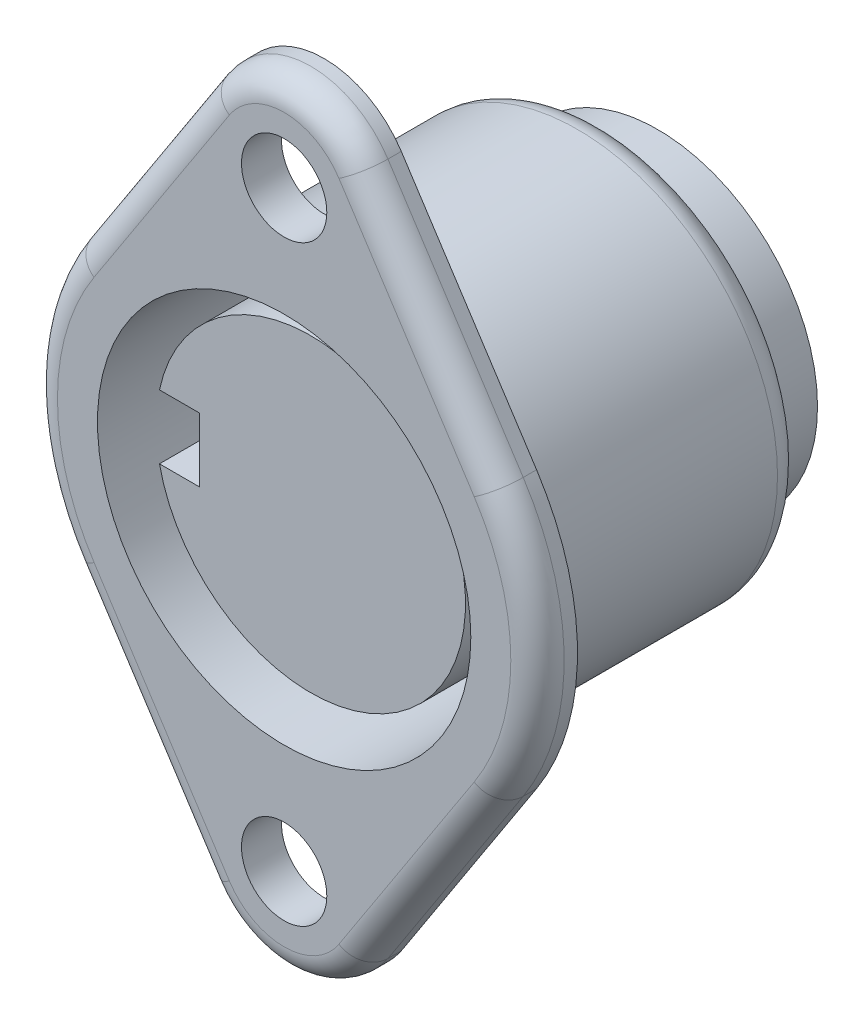
ISO-10303-21;
HEADER;
FILE_DESCRIPTION(('STEP AP214'),'2;1');
FILE_NAME('part.step','',(''),(''),'','','');
FILE_SCHEMA(('AUTOMOTIVE_DESIGN { 1 0 10303 214 1 1 1 1 }'));
ENDSEC;
DATA;
#1=APPLICATION_CONTEXT('core data for automotive mechanical design processes');
#2=APPLICATION_PROTOCOL_DEFINITION('international standard','automotive_design',2000,#1);
#3=PRODUCT_CONTEXT('',#1,'mechanical');
#4=PRODUCT('Part','Part','',(#3));
#5=PRODUCT_RELATED_PRODUCT_CATEGORY('part','',(#4));
#6=PRODUCT_DEFINITION_FORMATION('','',#4);
#7=PRODUCT_DEFINITION_CONTEXT('part definition',#1,'design');
#8=PRODUCT_DEFINITION('design','',#6,#7);
#9=PRODUCT_DEFINITION_SHAPE('','',#8);
#10=(LENGTH_UNIT() NAMED_UNIT(*) SI_UNIT(.MILLI.,.METRE.));
#11=(NAMED_UNIT(*) PLANE_ANGLE_UNIT() SI_UNIT($,.RADIAN.));
#12=(NAMED_UNIT(*) SI_UNIT($,.STERADIAN.) SOLID_ANGLE_UNIT());
#13=UNCERTAINTY_MEASURE_WITH_UNIT(LENGTH_MEASURE(1.E-05),#10,'distance_accuracy_value','');
#14=(GEOMETRIC_REPRESENTATION_CONTEXT(3) GLOBAL_UNCERTAINTY_ASSIGNED_CONTEXT((#13)) GLOBAL_UNIT_ASSIGNED_CONTEXT((#10,
#11,#12)) REPRESENTATION_CONTEXT('',''));
#15=CARTESIAN_POINT('',(0.,0.,0.));
#16=DIRECTION('',(0.,0.,1.));
#17=DIRECTION('',(1.,0.,0.));
#18=AXIS2_PLACEMENT_3D('',#15,#16,#17);
#19=CARTESIAN_POINT('',(0.,0.,3.66));
#20=DIRECTION('',(0.,0.,1.));
#21=DIRECTION('',(1.,0.,0.));
#22=AXIS2_PLACEMENT_3D('',#19,#20,#21);
#23=PLANE('',#22);
#24=CARTESIAN_POINT('',(0.,0.,3.66));
#25=DIRECTION('',(0.,0.,1.));
#26=DIRECTION('',(1.,0.,0.));
#27=AXIS2_PLACEMENT_3D('',#24,#25,#26);
#28=CIRCLE('',#27,7.);
#29=CARTESIAN_POINT('',(7.,0.,3.66));
#30=VERTEX_POINT('',#29);
#31=EDGE_CURVE('E186',#30,#30,#28,.T.);
#32=ORIENTED_EDGE('',*,*,#31,.T.);
#33=EDGE_LOOP('',(#32));
#34=FACE_BOUND('',#33,.T.);
#35=CARTESIAN_POINT('',(0.,0.,3.66));
#36=DIRECTION('',(0.,0.,1.));
#37=DIRECTION('',(1.,0.,0.));
#38=AXIS2_PLACEMENT_3D('',#35,#36,#37);
#39=CIRCLE('',#38,5.8);
#40=CARTESIAN_POINT('',(-5.67450438364444,-1.2,3.66));
#41=VERTEX_POINT('',#40);
#42=CARTESIAN_POINT('',(-5.67450438364444,1.2,3.66));
#43=VERTEX_POINT('',#42);
#44=EDGE_CURVE('E179',#41,#43,#39,.T.);
#45=ORIENTED_EDGE('',*,*,#44,.F.);
#46=DIRECTION('',(-1.,0.,0.));
#47=VECTOR('',#46,1.);
#48=CARTESIAN_POINT('',(-5.67450438364444,-1.2,3.66));
#49=LINE('',#48,#47);
#50=CARTESIAN_POINT('',(-4.17450438364444,-1.2,3.66));
#51=VERTEX_POINT('',#50);
#52=EDGE_CURVE('E177',#51,#41,#49,.T.);
#53=ORIENTED_EDGE('',*,*,#52,.F.);
#54=DIRECTION('',(0.,-1.,0.));
#55=VECTOR('',#54,1.);
#56=CARTESIAN_POINT('',(-4.17450438364444,-1.2,3.66));
#57=LINE('',#56,#55);
#58=CARTESIAN_POINT('',(-4.17450438364444,1.2,3.66));
#59=VERTEX_POINT('',#58);
#60=EDGE_CURVE('E156',#59,#51,#57,.T.);
#61=ORIENTED_EDGE('',*,*,#60,.F.);
#62=DIRECTION('',(1.,0.,0.));
#63=VECTOR('',#62,1.);
#64=CARTESIAN_POINT('',(-4.17450438364444,1.2,3.66));
#65=LINE('',#64,#63);
#66=EDGE_CURVE('E180',#43,#59,#65,.T.);
#67=ORIENTED_EDGE('',*,*,#66,.F.);
#68=EDGE_LOOP('',(#45,#53,#61,#67));
#69=FACE_BOUND('',#68,.T.);
#70=ADVANCED_FACE('F34',(#34,#69),#23,.T.);
#71=CARTESIAN_POINT('',(0.,0.,0.));
#72=DIRECTION('',(0.,0.,1.));
#73=DIRECTION('',(1.,0.,0.));
#74=AXIS2_PLACEMENT_3D('',#71,#72,#73);
#75=PLANE('',#74);
#76=CARTESIAN_POINT('',(0.,0.,0.));
#77=DIRECTION('',(0.,0.,1.));
#78=DIRECTION('',(1.,0.,0.));
#79=AXIS2_PLACEMENT_3D('',#76,#77,#78);
#80=CIRCLE('',#79,6.5);
#81=CARTESIAN_POINT('',(6.5,0.,0.));
#82=VERTEX_POINT('',#81);
#83=EDGE_CURVE('E253',#82,#82,#80,.F.);
#84=ORIENTED_EDGE('',*,*,#83,.T.);
#85=EDGE_LOOP('',(#84));
#86=FACE_BOUND('',#85,.T.);
#87=CARTESIAN_POINT('',(0.,0.,0.));
#88=DIRECTION('',(0.,0.,1.));
#89=DIRECTION('',(1.,0.,0.));
#90=AXIS2_PLACEMENT_3D('',#87,#88,#89);
#91=CIRCLE('',#90,6.);
#92=CARTESIAN_POINT('',(6.,0.,0.));
#93=VERTEX_POINT('',#92);
#94=EDGE_CURVE('E256',#93,#93,#91,.F.);
#95=ORIENTED_EDGE('',*,*,#94,.F.);
#96=EDGE_LOOP('',(#95));
#97=FACE_BOUND('',#96,.T.);
#98=ADVANCED_FACE('F390',(#86,#97),#75,.F.);
#99=CARTESIAN_POINT('',(0.,0.,10.5));
#100=DIRECTION('',(0.,0.,-1.));
#101=DIRECTION('',(-1.,0.,0.));
#102=AXIS2_PLACEMENT_3D('',#99,#100,#101);
#103=CYLINDRICAL_SURFACE('',#102,7.5);
#104=CARTESIAN_POINT('',(0.,0.,0.999999999999999));
#105=DIRECTION('',(0.,0.,1.));
#106=DIRECTION('',(1.,0.,0.));
#107=AXIS2_PLACEMENT_3D('',#104,#105,#106);
#108=CIRCLE('',#107,7.5);
#109=CARTESIAN_POINT('',(-7.5,0.,0.999999999999997));
#110=VERTEX_POINT('',#109);
#111=EDGE_CURVE('E250',#110,#110,#108,.T.);
#112=CARTESIAN_POINT('',(0.,0.,10.5));
#113=DIRECTION('',(0.,0.,1.));
#114=DIRECTION('',(1.,0.,0.));
#115=AXIS2_PLACEMENT_3D('',#112,#113,#114);
#116=CIRCLE('',#115,7.5);
#117=CARTESIAN_POINT('',(-7.5,0.,10.5));
#118=VERTEX_POINT('',#117);
#119=EDGE_CURVE('E247',#118,#118,#116,.T.);
#120=CARTESIAN_POINT('',(-7.5,0.,0.999999999999997));
#121=CARTESIAN_POINT('',(-7.5,0.,1.09895833333333));
#122=CARTESIAN_POINT('',(-7.5,0.,1.19791666666666));
#123=CARTESIAN_POINT('',(-7.5,0.,1.39583333333333));
#124=CARTESIAN_POINT('',(-7.5,0.,1.49479166666666));
#125=CARTESIAN_POINT('',(-7.5,0.,1.69270833333333));
#126=CARTESIAN_POINT('',(-7.5,0.,1.79166666666666));
#127=CARTESIAN_POINT('',(-7.5,0.,1.98958333333333));
#128=CARTESIAN_POINT('',(-7.5,0.,2.08854166666667));
#129=CARTESIAN_POINT('',(-7.5,0.,2.28645833333333));
#130=CARTESIAN_POINT('',(-7.5,0.,2.38541666666667));
#131=CARTESIAN_POINT('',(-7.5,0.,2.58333333333333));
#132=CARTESIAN_POINT('',(-7.5,0.,2.68229166666666));
#133=CARTESIAN_POINT('',(-7.5,0.,2.88020833333333));
#134=CARTESIAN_POINT('',(-7.5,0.,2.97916666666666));
#135=CARTESIAN_POINT('',(-7.5,0.,3.17708333333333));
#136=CARTESIAN_POINT('',(-7.5,0.,3.27604166666666));
#137=CARTESIAN_POINT('',(-7.5,0.,3.47395833333333));
#138=CARTESIAN_POINT('',(-7.5,0.,3.57291666666666));
#139=CARTESIAN_POINT('',(-7.5,0.,3.77083333333333));
#140=CARTESIAN_POINT('',(-7.5,0.,3.86979166666667));
#141=CARTESIAN_POINT('',(-7.5,0.,4.06770833333333));
#142=CARTESIAN_POINT('',(-7.5,0.,4.16666666666667));
#143=CARTESIAN_POINT('',(-7.5,0.,4.36458333333333));
#144=CARTESIAN_POINT('',(-7.5,0.,4.46354166666666));
#145=CARTESIAN_POINT('',(-7.5,0.,4.66145833333333));
#146=CARTESIAN_POINT('',(-7.5,0.,4.76041666666666));
#147=CARTESIAN_POINT('',(-7.5,0.,4.95833333333333));
#148=CARTESIAN_POINT('',(-7.5,0.,5.05729166666667));
#149=CARTESIAN_POINT('',(-7.5,0.,5.25520833333333));
#150=CARTESIAN_POINT('',(-7.5,0.,5.35416666666667));
#151=CARTESIAN_POINT('',(-7.5,0.,5.55208333333333));
#152=CARTESIAN_POINT('',(-7.5,0.,5.65104166666667));
#153=CARTESIAN_POINT('',(-7.5,0.,5.84895833333333));
#154=CARTESIAN_POINT('',(-7.5,0.,5.94791666666667));
#155=CARTESIAN_POINT('',(-7.5,0.,6.14583333333333));
#156=CARTESIAN_POINT('',(-7.5,0.,6.24479166666667));
#157=CARTESIAN_POINT('',(-7.5,0.,6.44270833333333));
#158=CARTESIAN_POINT('',(-7.5,0.,6.54166666666667));
#159=CARTESIAN_POINT('',(-7.5,0.,6.73958333333333));
#160=CARTESIAN_POINT('',(-7.5,0.,6.83854166666667));
#161=CARTESIAN_POINT('',(-7.5,0.,7.03645833333333));
#162=CARTESIAN_POINT('',(-7.5,0.,7.13541666666667));
#163=CARTESIAN_POINT('',(-7.5,0.,7.33333333333333));
#164=CARTESIAN_POINT('',(-7.5,0.,7.43229166666667));
#165=CARTESIAN_POINT('',(-7.5,0.,7.63020833333333));
#166=CARTESIAN_POINT('',(-7.5,0.,7.72916666666667));
#167=CARTESIAN_POINT('',(-7.5,0.,7.92708333333333));
#168=CARTESIAN_POINT('',(-7.5,0.,8.02604166666667));
#169=CARTESIAN_POINT('',(-7.5,0.,8.22395833333333));
#170=CARTESIAN_POINT('',(-7.5,0.,8.32291666666667));
#171=CARTESIAN_POINT('',(-7.5,0.,8.52083333333333));
#172=CARTESIAN_POINT('',(-7.5,0.,8.61979166666667));
#173=CARTESIAN_POINT('',(-7.5,0.,8.81770833333333));
#174=CARTESIAN_POINT('',(-7.5,0.,8.91666666666667));
#175=CARTESIAN_POINT('',(-7.5,0.,9.11458333333333));
#176=CARTESIAN_POINT('',(-7.5,0.,9.21354166666667));
#177=CARTESIAN_POINT('',(-7.5,0.,9.41145833333333));
#178=CARTESIAN_POINT('',(-7.5,0.,9.51041666666667));
#179=CARTESIAN_POINT('',(-7.5,0.,9.70833333333333));
#180=CARTESIAN_POINT('',(-7.5,0.,9.80729166666667));
#181=CARTESIAN_POINT('',(-7.5,0.,10.0052083333333));
#182=CARTESIAN_POINT('',(-7.5,0.,10.1041666666667));
#183=CARTESIAN_POINT('',(-7.5,0.,10.3020833333333));
#184=CARTESIAN_POINT('',(-7.5,0.,10.4010416666667));
#185=CARTESIAN_POINT('',(-7.5,0.,10.5));
#186=B_SPLINE_CURVE_WITH_KNOTS('',3,(#120,#121,#122,#123,#124,#125,#126,#127,#128,#129,#130,
#131,#132,#133,#134,#135,#136,#137,#138,#139,#140,#141,#142,#143,#144,#145,#146,#147,#148,#149,
#150,#151,#152,#153,#154,#155,#156,#157,#158,#159,#160,#161,#162,#163,#164,#165,#166,#167,#168,
#169,#170,#171,#172,#173,#174,#175,#176,#177,#178,#179,#180,#181,#182,#183,#184,#185),
.UNSPECIFIED.,.F.,.F.,(4,2,2,2,2,2,2,2,2,2,2,2,2,2,2,2,2,2,2,2,2,2,2,2,2,2,2,2,2,2,2,2,4),(0.,
0.296875,0.593750000000001,0.890625000000001,1.1875,1.484375,1.78125,2.078125,2.375,2.671875,
2.96875,3.265625,3.5625,3.859375,4.15625,4.453125,4.75,5.046875,5.34375,5.640625,5.9375,
6.234375,6.53125,6.828125,7.125,7.421875,7.71875,8.015625,8.3125,8.609375,8.90625,9.203125,9.5),.UNSPECIFIED.);
#187=EDGE_CURVE('BSEAM396',#110,#118,#186,.T.);
#188=ORIENTED_EDGE('',*,*,#111,.T.);
#189=ORIENTED_EDGE('',*,*,#119,.F.);
#190=ORIENTED_EDGE('',*,*,#187,.T.);
#191=ORIENTED_EDGE('',*,*,#187,.F.);
#192=EDGE_LOOP('',(#188,#190,#189,#191));
#193=FACE_BOUND('',#192,.T.);
#194=ADVANCED_FACE('F396',(#193),#103,.T.);
#195=CARTESIAN_POINT('',(0.,0.,0.999999999999999));
#196=DIRECTION('',(0.,0.,1.));
#197=DIRECTION('',(1.,0.,0.));
#198=AXIS2_PLACEMENT_3D('',#195,#196,#197);
#199=TOROIDAL_SURFACE('',#198,6.5,1.);
#200=ORIENTED_EDGE('',*,*,#83,.F.);
#201=EDGE_LOOP('',(#200));
#202=FACE_BOUND('',#201,.T.);
#203=ORIENTED_EDGE('',*,*,#111,.F.);
#204=EDGE_LOOP('',(#203));
#205=FACE_BOUND('',#204,.T.);
#206=ADVANCED_FACE('F442',(#202,#205),#199,.T.);
#207=CARTESIAN_POINT('',(0.,0.,-2.));
#208=DIRECTION('',(0.,0.,1.));
#209=DIRECTION('',(1.,0.,0.));
#210=AXIS2_PLACEMENT_3D('',#207,#208,#209);
#211=CYLINDRICAL_SURFACE('',#210,6.);
#212=CARTESIAN_POINT('',(0.,0.,-2.));
#213=DIRECTION('',(0.,0.,-1.));
#214=DIRECTION('',(-1.,0.,0.));
#215=AXIS2_PLACEMENT_3D('',#212,#213,#214);
#216=CIRCLE('',#215,6.);
#217=CARTESIAN_POINT('',(-6.,0.,-2.));
#218=VERTEX_POINT('',#217);
#219=EDGE_CURVE('E244',#218,#218,#216,.T.);
#220=ORIENTED_EDGE('',*,*,#219,.F.);
#221=EDGE_LOOP('',(#220));
#222=FACE_BOUND('',#221,.T.);
#223=ORIENTED_EDGE('',*,*,#94,.T.);
#224=EDGE_LOOP('',(#223));
#225=FACE_BOUND('',#224,.T.);
#226=ADVANCED_FACE('F439',(#222,#225),#211,.T.);
#227=CARTESIAN_POINT('',(0.,0.,-2.));
#228=DIRECTION('',(0.,0.,-1.));
#229=DIRECTION('',(-1.,0.,0.));
#230=AXIS2_PLACEMENT_3D('',#227,#228,#229);
#231=PLANE('',#230);
#232=ORIENTED_EDGE('',*,*,#219,.T.);
#233=EDGE_LOOP('',(#232));
#234=FACE_BOUND('',#233,.T.);
#235=ADVANCED_FACE('F417',(#234),#231,.T.);
#236=CARTESIAN_POINT('',(0.,0.,10.5));
#237=DIRECTION('',(0.,0.,-1.));
#238=DIRECTION('',(-1.,0.,0.));
#239=AXIS2_PLACEMENT_3D('',#236,#237,#238);
#240=PLANE('',#239);
#241=CARTESIAN_POINT('',(0.,11.1,10.5));
#242=DIRECTION('',(0.,0.,1.));
#243=DIRECTION('',(1.,0.,0.));
#244=AXIS2_PLACEMENT_3D('',#241,#242,#243);
#245=CIRCLE('',#244,1.6);
#246=CARTESIAN_POINT('',(1.6,11.1,10.5));
#247=VERTEX_POINT('',#246);
#248=EDGE_CURVE('E196',#247,#247,#245,.T.);
#249=ORIENTED_EDGE('',*,*,#248,.T.);
#250=EDGE_LOOP('',(#249));
#251=FACE_BOUND('',#250,.T.);
#252=CARTESIAN_POINT('',(0.,0.,10.5));
#253=DIRECTION('',(0.,0.,1.));
#254=DIRECTION('',(-1.,0.,0.));
#255=AXIS2_PLACEMENT_3D('',#252,#253,#254);
#256=CIRCLE('',#255,9.50000000000004);
#257=CARTESIAN_POINT('',(-7.96486424072526,5.17792792792793,10.5));
#258=VERTEX_POINT('',#257);
#259=CARTESIAN_POINT('',(-7.96486424072527,-5.17792792792793,10.5));
#260=VERTEX_POINT('',#259);
#261=EDGE_CURVE('E202',#258,#260,#256,.T.);
#262=ORIENTED_EDGE('',*,*,#261,.F.);
#263=DIRECTION('',(-0.545045045045045,-0.838406762181606,0.));
#264=VECTOR('',#263,1.);
#265=CARTESIAN_POINT('',(-7.96486424072526,5.17792792792793,10.5));
#266=LINE('',#265,#264);
#267=CARTESIAN_POINT('',(-2.89250332952654,12.9804054054054,10.5));
#268=VERTEX_POINT('',#267);
#269=EDGE_CURVE('E225',#268,#258,#266,.T.);
#270=ORIENTED_EDGE('',*,*,#269,.F.);
#271=CARTESIAN_POINT('',(0.,11.1,10.5));
#272=DIRECTION('',(0.,0.,1.));
#273=DIRECTION('',(-1.,0.,0.));
#274=AXIS2_PLACEMENT_3D('',#271,#272,#273);
#275=CIRCLE('',#274,3.45);
#276=CARTESIAN_POINT('',(2.89250332952654,12.9804054054054,10.5));
#277=VERTEX_POINT('',#276);
#278=EDGE_CURVE('E222',#277,#268,#275,.T.);
#279=ORIENTED_EDGE('',*,*,#278,.F.);
#280=DIRECTION('',(-0.545045045045045,0.838406762181607,0.));
#281=VECTOR('',#280,1.);
#282=CARTESIAN_POINT('',(7.96486424072526,5.17792792792793,10.5));
#283=LINE('',#282,#281);
#284=CARTESIAN_POINT('',(7.96486424072526,5.17792792792793,10.5));
#285=VERTEX_POINT('',#284);
#286=EDGE_CURVE('E219',#285,#277,#283,.T.);
#287=ORIENTED_EDGE('',*,*,#286,.F.);
#288=CARTESIAN_POINT('',(0.,0.,10.5));
#289=DIRECTION('',(0.,0.,1.));
#290=DIRECTION('',(1.,0.,0.));
#291=AXIS2_PLACEMENT_3D('',#288,#289,#290);
#292=CIRCLE('',#291,9.50000000000002);
#293=CARTESIAN_POINT('',(7.96486424072526,-5.17792792792793,10.5));
#294=VERTEX_POINT('',#293);
#295=EDGE_CURVE('E216',#294,#285,#292,.T.);
#296=ORIENTED_EDGE('',*,*,#295,.F.);
#297=DIRECTION('',(0.545045045045045,0.838406762181607,0.));
#298=VECTOR('',#297,1.);
#299=CARTESIAN_POINT('',(7.96486424072526,-5.17792792792793,10.5));
#300=LINE('',#299,#298);
#301=CARTESIAN_POINT('',(2.89250332952654,-12.9804054054054,10.5));
#302=VERTEX_POINT('',#301);
#303=EDGE_CURVE('E213',#302,#294,#300,.T.);
#304=ORIENTED_EDGE('',*,*,#303,.F.);
#305=CARTESIAN_POINT('',(0.,-11.1,10.5));
#306=DIRECTION('',(0.,0.,1.));
#307=DIRECTION('',(1.,0.,0.));
#308=AXIS2_PLACEMENT_3D('',#305,#306,#307);
#309=CIRCLE('',#308,3.45);
#310=CARTESIAN_POINT('',(-2.89250332952655,-12.9804054054054,10.5));
#311=VERTEX_POINT('',#310);
#312=EDGE_CURVE('E210',#311,#302,#309,.T.);
#313=ORIENTED_EDGE('',*,*,#312,.F.);
#314=DIRECTION('',(0.545045045045045,-0.838406762181606,0.));
#315=VECTOR('',#314,1.);
#316=CARTESIAN_POINT('',(-7.96486424072527,-5.17792792792793,10.5));
#317=LINE('',#316,#315);
#318=EDGE_CURVE('E207',#260,#311,#317,.T.);
#319=ORIENTED_EDGE('',*,*,#318,.F.);
#320=EDGE_LOOP('',(#262,#270,#279,#287,#296,#304,#313,#319));
#321=FACE_BOUND('',#320,.T.);
#322=CARTESIAN_POINT('',(0.,-11.1,10.5));
#323=DIRECTION('',(0.,0.,1.));
#324=DIRECTION('',(1.,0.,0.));
#325=AXIS2_PLACEMENT_3D('',#322,#323,#324);
#326=CIRCLE('',#325,1.6);
#327=CARTESIAN_POINT('',(1.6,-11.1,10.5));
#328=VERTEX_POINT('',#327);
#329=EDGE_CURVE('E195',#328,#328,#326,.T.);
#330=ORIENTED_EDGE('',*,*,#329,.T.);
#331=EDGE_LOOP('',(#330));
#332=FACE_BOUND('',#331,.T.);
#333=ORIENTED_EDGE('',*,*,#119,.T.);
#334=EDGE_LOOP('',(#333));
#335=FACE_BOUND('',#334,.T.);
#336=ADVANCED_FACE('F332',(#251,#321,#332,#335),#240,.T.);
#337=CARTESIAN_POINT('',(0.,0.,12.));
#338=DIRECTION('',(0.,0.,-1.));
#339=DIRECTION('',(-1.,0.,0.));
#340=AXIS2_PLACEMENT_3D('',#337,#338,#339);
#341=PLANE('',#340);
#342=CARTESIAN_POINT('',(0.,0.,12.));
#343=DIRECTION('',(0.,0.,1.));
#344=DIRECTION('',(1.,0.,0.));
#345=AXIS2_PLACEMENT_3D('',#342,#343,#344);
#346=CIRCLE('',#345,7.);
#347=CARTESIAN_POINT('',(7.,0.,12.));
#348=VERTEX_POINT('',#347);
#349=EDGE_CURVE('E185',#348,#348,#346,.T.);
#350=ORIENTED_EDGE('',*,*,#349,.F.);
#351=EDGE_LOOP('',(#350));
#352=FACE_BOUND('',#351,.T.);
#353=DIRECTION('',(-0.545045045045045,-0.838406762181606,0.));
#354=VECTOR('',#353,1.);
#355=CARTESIAN_POINT('',(-7.12645747854365,4.6328828828829,12.));
#356=LINE('',#355,#354);
#357=CARTESIAN_POINT('',(-2.05409656734494,12.4353603603604,12.));
#358=VERTEX_POINT('',#357);
#359=CARTESIAN_POINT('',(-7.12645747854365,4.63288288288289,12.));
#360=VERTEX_POINT('',#359);
#361=EDGE_CURVE('E271',#358,#360,#356,.T.);
#362=ORIENTED_EDGE('',*,*,#361,.T.);
#363=CARTESIAN_POINT('',(0.,0.,12.));
#364=DIRECTION('',(0.,0.,-1.));
#365=DIRECTION('',(-1.,0.,0.));
#366=AXIS2_PLACEMENT_3D('',#363,#364,#365);
#367=CIRCLE('',#366,8.50000000000004);
#368=CARTESIAN_POINT('',(-7.12645747854366,-4.63288288288289,12.));
#369=VERTEX_POINT('',#368);
#370=EDGE_CURVE('E273',#360,#369,#367,.F.);
#371=ORIENTED_EDGE('',*,*,#370,.T.);
#372=DIRECTION('',(0.545045045045045,-0.838406762181606,0.));
#373=VECTOR('',#372,1.);
#374=CARTESIAN_POINT('',(-7.12645747854364,-4.63288288288291,12.));
#375=LINE('',#374,#373);
#376=CARTESIAN_POINT('',(-2.05409656734494,-12.4353603603604,12.));
#377=VERTEX_POINT('',#376);
#378=EDGE_CURVE('E259',#369,#377,#375,.T.);
#379=ORIENTED_EDGE('',*,*,#378,.T.);
#380=CARTESIAN_POINT('',(0.,-11.1,12.));
#381=DIRECTION('',(0.,0.,-1.));
#382=DIRECTION('',(-1.,0.,0.));
#383=AXIS2_PLACEMENT_3D('',#380,#381,#382);
#384=CIRCLE('',#383,2.45);
#385=CARTESIAN_POINT('',(2.05409656734494,-12.4353603603604,12.));
#386=VERTEX_POINT('',#385);
#387=EDGE_CURVE('E261',#377,#386,#384,.F.);
#388=ORIENTED_EDGE('',*,*,#387,.T.);
#389=DIRECTION('',(0.545045045045045,0.838406762181607,0.));
#390=VECTOR('',#389,1.);
#391=CARTESIAN_POINT('',(7.12645747854366,-4.63288288288286,12.));
#392=LINE('',#391,#390);
#393=CARTESIAN_POINT('',(7.12645747854365,-4.63288288288288,12.));
#394=VERTEX_POINT('',#393);
#395=EDGE_CURVE('E263',#386,#394,#392,.T.);
#396=ORIENTED_EDGE('',*,*,#395,.T.);
#397=CARTESIAN_POINT('',(0.,0.,12.));
#398=DIRECTION('',(0.,0.,-1.));
#399=DIRECTION('',(-1.,0.,0.));
#400=AXIS2_PLACEMENT_3D('',#397,#398,#399);
#401=CIRCLE('',#400,8.50000000000002);
#402=CARTESIAN_POINT('',(7.12645747854365,4.63288288288288,12.));
#403=VERTEX_POINT('',#402);
#404=EDGE_CURVE('E265',#394,#403,#401,.F.);
#405=ORIENTED_EDGE('',*,*,#404,.T.);
#406=DIRECTION('',(-0.545045045045045,0.838406762181607,0.));
#407=VECTOR('',#406,1.);
#408=CARTESIAN_POINT('',(7.12645747854367,4.63288288288286,12.));
#409=LINE('',#408,#407);
#410=CARTESIAN_POINT('',(2.05409656734494,12.4353603603604,12.));
#411=VERTEX_POINT('',#410);
#412=EDGE_CURVE('E267',#403,#411,#409,.T.);
#413=ORIENTED_EDGE('',*,*,#412,.T.);
#414=CARTESIAN_POINT('',(0.,11.1,12.));
#415=DIRECTION('',(0.,0.,-1.));
#416=DIRECTION('',(-1.,0.,0.));
#417=AXIS2_PLACEMENT_3D('',#414,#415,#416);
#418=CIRCLE('',#417,2.45);
#419=EDGE_CURVE('E269',#411,#358,#418,.F.);
#420=ORIENTED_EDGE('',*,*,#419,.T.);
#421=EDGE_LOOP('',(#362,#371,#379,#388,#396,#405,#413,#420));
#422=FACE_BOUND('',#421,.T.);
#423=CARTESIAN_POINT('',(0.,-11.1,12.));
#424=DIRECTION('',(0.,0.,1.));
#425=DIRECTION('',(1.,0.,0.));
#426=AXIS2_PLACEMENT_3D('',#423,#424,#425);
#427=CIRCLE('',#426,1.6);
#428=CARTESIAN_POINT('',(1.6,-11.1,12.));
#429=VERTEX_POINT('',#428);
#430=EDGE_CURVE('E199',#429,#429,#427,.T.);
#431=ORIENTED_EDGE('',*,*,#430,.F.);
#432=EDGE_LOOP('',(#431));
#433=FACE_BOUND('',#432,.T.);
#434=CARTESIAN_POINT('',(0.,11.1,12.));
#435=DIRECTION('',(0.,0.,1.));
#436=DIRECTION('',(1.,0.,0.));
#437=AXIS2_PLACEMENT_3D('',#434,#435,#436);
#438=CIRCLE('',#437,1.6);
#439=CARTESIAN_POINT('',(1.6,11.1,12.));
#440=VERTEX_POINT('',#439);
#441=EDGE_CURVE('E192',#440,#440,#438,.T.);
#442=ORIENTED_EDGE('',*,*,#441,.F.);
#443=EDGE_LOOP('',(#442));
#444=FACE_BOUND('',#443,.T.);
#445=ADVANCED_FACE('F354',(#352,#422,#433,#444),#341,.F.);
#446=CARTESIAN_POINT('',(0.,0.,12.));
#447=DIRECTION('',(0.,0.,-1.));
#448=DIRECTION('',(-1.,0.,0.));
#449=AXIS2_PLACEMENT_3D('',#446,#447,#448);
#450=CYLINDRICAL_SURFACE('',#449,9.50000000000004);
#451=DIRECTION('',(0.,0.,-1.));
#452=VECTOR('',#451,1.);
#453=CARTESIAN_POINT('',(-7.96486424072527,-5.17792792792793,12.));
#454=LINE('',#453,#452);
#455=CARTESIAN_POINT('',(-7.96486424072527,-5.17792792792793,11.));
#456=VERTEX_POINT('',#455);
#457=EDGE_CURVE('E242',#456,#260,#454,.T.);
#458=ORIENTED_EDGE('',*,*,#457,.F.);
#459=CARTESIAN_POINT('',(0.,0.,11.));
#460=DIRECTION('',(0.,0.,-1.));
#461=DIRECTION('',(-1.,0.,0.));
#462=AXIS2_PLACEMENT_3D('',#459,#460,#461);
#463=CIRCLE('',#462,9.50000000000004);
#464=CARTESIAN_POINT('',(-7.96486424072526,5.17792792792793,11.));
#465=VERTEX_POINT('',#464);
#466=EDGE_CURVE('E276',#456,#465,#463,.T.);
#467=ORIENTED_EDGE('',*,*,#466,.T.);
#468=DIRECTION('',(0.,0.,-1.));
#469=VECTOR('',#468,1.);
#470=CARTESIAN_POINT('',(-7.96486424072526,5.17792792792793,12.));
#471=LINE('',#470,#469);
#472=EDGE_CURVE('E228',#465,#258,#471,.T.);
#473=ORIENTED_EDGE('',*,*,#472,.T.);
#474=ORIENTED_EDGE('',*,*,#261,.T.);
#475=EDGE_LOOP('',(#458,#467,#473,#474));
#476=FACE_BOUND('',#475,.T.);
#477=ADVANCED_FACE('F373',(#476),#450,.T.);
#478=CARTESIAN_POINT('',(-7.96486424072527,-5.17792792792793,12.));
#479=DIRECTION('',(0.838406762181606,0.545045045045045,0.));
#480=DIRECTION('',(-0.545045045045045,0.838406762181606,0.));
#481=AXIS2_PLACEMENT_3D('',#478,#479,#480);
#482=PLANE('',#481);
#483=DIRECTION('',(0.,0.,-1.));
#484=VECTOR('',#483,1.);
#485=CARTESIAN_POINT('',(-2.89250332952655,-12.9804054054054,12.));
#486=LINE('',#485,#484);
#487=CARTESIAN_POINT('',(-2.89250332952655,-12.9804054054054,11.));
#488=VERTEX_POINT('',#487);
#489=EDGE_CURVE('E240',#488,#311,#486,.T.);
#490=ORIENTED_EDGE('',*,*,#489,.F.);
#491=DIRECTION('',(0.545045045045045,-0.838406762181606,0.));
#492=VECTOR('',#491,1.);
#493=CARTESIAN_POINT('',(-7.96486424072527,-5.17792792792793,11.));
#494=LINE('',#493,#492);
#495=EDGE_CURVE('E12',#488,#456,#494,.F.);
#496=ORIENTED_EDGE('',*,*,#495,.T.);
#497=ORIENTED_EDGE('',*,*,#457,.T.);
#498=ORIENTED_EDGE('',*,*,#318,.T.);
#499=EDGE_LOOP('',(#490,#496,#497,#498));
#500=FACE_BOUND('',#499,.T.);
#501=ADVANCED_FACE('F369',(#500),#482,.F.);
#502=CARTESIAN_POINT('',(0.,-11.1,12.));
#503=DIRECTION('',(0.,0.,-1.));
#504=DIRECTION('',(-1.,0.,0.));
#505=AXIS2_PLACEMENT_3D('',#502,#503,#504);
#506=CYLINDRICAL_SURFACE('',#505,3.45);
#507=DIRECTION('',(0.,0.,-1.));
#508=VECTOR('',#507,1.);
#509=CARTESIAN_POINT('',(2.89250332952654,-12.9804054054054,12.));
#510=LINE('',#509,#508);
#511=CARTESIAN_POINT('',(2.89250332952654,-12.9804054054054,11.));
#512=VERTEX_POINT('',#511);
#513=EDGE_CURVE('E238',#512,#302,#510,.T.);
#514=ORIENTED_EDGE('',*,*,#513,.F.);
#515=CARTESIAN_POINT('',(0.,-11.1,11.));
#516=DIRECTION('',(0.,0.,-1.));
#517=DIRECTION('',(-1.,0.,0.));
#518=AXIS2_PLACEMENT_3D('',#515,#516,#517);
#519=CIRCLE('',#518,3.45);
#520=EDGE_CURVE('E43',#512,#488,#519,.T.);
#521=ORIENTED_EDGE('',*,*,#520,.T.);
#522=ORIENTED_EDGE('',*,*,#489,.T.);
#523=ORIENTED_EDGE('',*,*,#312,.T.);
#524=EDGE_LOOP('',(#514,#521,#522,#523));
#525=FACE_BOUND('',#524,.T.);
#526=ADVANCED_FACE('F430',(#525),#506,.T.);
#527=CARTESIAN_POINT('',(7.96486424072526,-5.17792792792793,12.));
#528=DIRECTION('',(-0.838406762181607,0.545045045045045,0.));
#529=DIRECTION('',(-0.545045045045045,-0.838406762181607,0.));
#530=AXIS2_PLACEMENT_3D('',#527,#528,#529);
#531=PLANE('',#530);
#532=DIRECTION('',(0.,0.,-1.));
#533=VECTOR('',#532,1.);
#534=CARTESIAN_POINT('',(7.96486424072526,-5.17792792792793,12.));
#535=LINE('',#534,#533);
#536=CARTESIAN_POINT('',(7.96486424072526,-5.17792792792793,11.));
#537=VERTEX_POINT('',#536);
#538=EDGE_CURVE('E236',#537,#294,#535,.T.);
#539=ORIENTED_EDGE('',*,*,#538,.F.);
#540=DIRECTION('',(0.545045045045045,0.838406762181607,0.));
#541=VECTOR('',#540,1.);
#542=CARTESIAN_POINT('',(7.96486424072526,-5.17792792792793,11.));
#543=LINE('',#542,#541);
#544=EDGE_CURVE('E287',#537,#512,#543,.F.);
#545=ORIENTED_EDGE('',*,*,#544,.T.);
#546=ORIENTED_EDGE('',*,*,#513,.T.);
#547=ORIENTED_EDGE('',*,*,#303,.T.);
#548=EDGE_LOOP('',(#539,#545,#546,#547));
#549=FACE_BOUND('',#548,.T.);
#550=ADVANCED_FACE('F325',(#549),#531,.F.);
#551=CARTESIAN_POINT('',(0.,0.,12.));
#552=DIRECTION('',(0.,0.,-1.));
#553=DIRECTION('',(-1.,0.,0.));
#554=AXIS2_PLACEMENT_3D('',#551,#552,#553);
#555=CYLINDRICAL_SURFACE('',#554,9.50000000000002);
#556=DIRECTION('',(0.,0.,-1.));
#557=VECTOR('',#556,1.);
#558=CARTESIAN_POINT('',(7.96486424072526,5.17792792792793,12.));
#559=LINE('',#558,#557);
#560=CARTESIAN_POINT('',(7.96486424072526,5.17792792792793,11.));
#561=VERTEX_POINT('',#560);
#562=EDGE_CURVE('E234',#561,#285,#559,.T.);
#563=ORIENTED_EDGE('',*,*,#562,.F.);
#564=CARTESIAN_POINT('',(0.,0.,11.));
#565=DIRECTION('',(0.,0.,-1.));
#566=DIRECTION('',(-1.,0.,0.));
#567=AXIS2_PLACEMENT_3D('',#564,#565,#566);
#568=CIRCLE('',#567,9.50000000000002);
#569=EDGE_CURVE('E285',#561,#537,#568,.T.);
#570=ORIENTED_EDGE('',*,*,#569,.T.);
#571=ORIENTED_EDGE('',*,*,#538,.T.);
#572=ORIENTED_EDGE('',*,*,#295,.T.);
#573=EDGE_LOOP('',(#563,#570,#571,#572));
#574=FACE_BOUND('',#573,.T.);
#575=ADVANCED_FACE('F323',(#574),#555,.T.);
#576=CARTESIAN_POINT('',(7.96486424072526,5.17792792792793,12.));
#577=DIRECTION('',(-0.838406762181607,-0.545045045045045,0.));
#578=DIRECTION('',(0.545045045045045,-0.838406762181607,0.));
#579=AXIS2_PLACEMENT_3D('',#576,#577,#578);
#580=PLANE('',#579);
#581=DIRECTION('',(0.,0.,-1.));
#582=VECTOR('',#581,1.);
#583=CARTESIAN_POINT('',(2.89250332952654,12.9804054054054,12.));
#584=LINE('',#583,#582);
#585=CARTESIAN_POINT('',(2.89250332952654,12.9804054054054,11.));
#586=VERTEX_POINT('',#585);
#587=EDGE_CURVE('E232',#586,#277,#584,.T.);
#588=ORIENTED_EDGE('',*,*,#587,.F.);
#589=DIRECTION('',(-0.545045045045045,0.838406762181607,0.));
#590=VECTOR('',#589,1.);
#591=CARTESIAN_POINT('',(7.96486424072526,5.17792792792793,11.));
#592=LINE('',#591,#590);
#593=EDGE_CURVE('E283',#586,#561,#592,.F.);
#594=ORIENTED_EDGE('',*,*,#593,.T.);
#595=ORIENTED_EDGE('',*,*,#562,.T.);
#596=ORIENTED_EDGE('',*,*,#286,.T.);
#597=EDGE_LOOP('',(#588,#594,#595,#596));
#598=FACE_BOUND('',#597,.T.);
#599=ADVANCED_FACE('F338',(#598),#580,.F.);
#600=CARTESIAN_POINT('',(0.,11.1,12.));
#601=DIRECTION('',(0.,0.,-1.));
#602=DIRECTION('',(-1.,0.,0.));
#603=AXIS2_PLACEMENT_3D('',#600,#601,#602);
#604=CYLINDRICAL_SURFACE('',#603,3.45);
#605=DIRECTION('',(0.,0.,-1.));
#606=VECTOR('',#605,1.);
#607=CARTESIAN_POINT('',(-2.89250332952654,12.9804054054054,12.));
#608=LINE('',#607,#606);
#609=CARTESIAN_POINT('',(-2.89250332952654,12.9804054054054,11.));
#610=VERTEX_POINT('',#609);
#611=EDGE_CURVE('E230',#610,#268,#608,.T.);
#612=ORIENTED_EDGE('',*,*,#611,.F.);
#613=CARTESIAN_POINT('',(0.,11.1,11.));
#614=DIRECTION('',(0.,0.,-1.));
#615=DIRECTION('',(-1.,0.,0.));
#616=AXIS2_PLACEMENT_3D('',#613,#614,#615);
#617=CIRCLE('',#616,3.45);
#618=EDGE_CURVE('E281',#610,#586,#617,.T.);
#619=ORIENTED_EDGE('',*,*,#618,.T.);
#620=ORIENTED_EDGE('',*,*,#587,.T.);
#621=ORIENTED_EDGE('',*,*,#278,.T.);
#622=EDGE_LOOP('',(#612,#619,#620,#621));
#623=FACE_BOUND('',#622,.T.);
#624=ADVANCED_FACE('F341',(#623),#604,.T.);
#625=CARTESIAN_POINT('',(-7.96486424072526,5.17792792792793,12.));
#626=DIRECTION('',(0.838406762181606,-0.545045045045045,0.));
#627=DIRECTION('',(0.545045045045045,0.838406762181606,0.));
#628=AXIS2_PLACEMENT_3D('',#625,#626,#627);
#629=PLANE('',#628);
#630=ORIENTED_EDGE('',*,*,#472,.F.);
#631=DIRECTION('',(-0.545045045045045,-0.838406762181606,0.));
#632=VECTOR('',#631,1.);
#633=CARTESIAN_POINT('',(-7.96486424072526,5.17792792792793,11.));
#634=LINE('',#633,#632);
#635=EDGE_CURVE('E279',#465,#610,#634,.F.);
#636=ORIENTED_EDGE('',*,*,#635,.T.);
#637=ORIENTED_EDGE('',*,*,#611,.T.);
#638=ORIENTED_EDGE('',*,*,#269,.T.);
#639=EDGE_LOOP('',(#630,#636,#637,#638));
#640=FACE_BOUND('',#639,.T.);
#641=ADVANCED_FACE('F410',(#640),#629,.F.);
#642=CARTESIAN_POINT('',(0.,-11.1,12.));
#643=DIRECTION('',(0.,0.,-1.));
#644=DIRECTION('',(-1.,0.,0.));
#645=AXIS2_PLACEMENT_3D('',#642,#643,#644);
#646=CYLINDRICAL_SURFACE('',#645,1.6);
#647=ORIENTED_EDGE('',*,*,#430,.T.);
#648=EDGE_LOOP('',(#647));
#649=FACE_BOUND('',#648,.T.);
#650=ORIENTED_EDGE('',*,*,#329,.F.);
#651=EDGE_LOOP('',(#650));
#652=FACE_BOUND('',#651,.T.);
#653=ADVANCED_FACE('F406',(#649,#652),#646,.F.);
#654=CARTESIAN_POINT('',(0.,11.1,12.));
#655=DIRECTION('',(0.,0.,-1.));
#656=DIRECTION('',(-1.,0.,0.));
#657=AXIS2_PLACEMENT_3D('',#654,#655,#656);
#658=CYLINDRICAL_SURFACE('',#657,1.6);
#659=ORIENTED_EDGE('',*,*,#441,.T.);
#660=EDGE_LOOP('',(#659));
#661=FACE_BOUND('',#660,.T.);
#662=ORIENTED_EDGE('',*,*,#248,.F.);
#663=EDGE_LOOP('',(#662));
#664=FACE_BOUND('',#663,.T.);
#665=ADVANCED_FACE('F403',(#661,#664),#658,.F.);
#666=CARTESIAN_POINT('',(0.,0.,11.));
#667=DIRECTION('',(0.,0.,-1.));
#668=DIRECTION('',(-1.,0.,0.));
#669=AXIS2_PLACEMENT_3D('',#666,#667,#668);
#670=TOROIDAL_SURFACE('',#669,8.50000000000002,1.);
#671=CARTESIAN_POINT('',(7.12645747854365,-4.63288288288288,11.));
#672=DIRECTION('',(-0.545045045045044,-0.838406762181607,0.));
#673=DIRECTION('',(0.838406762181607,-0.545045045045044,0.));
#674=AXIS2_PLACEMENT_3D('',#671,#672,#673);
#675=CIRCLE('',#674,1.);
#676=EDGE_CURVE('E304',#537,#394,#675,.T.);
#677=ORIENTED_EDGE('',*,*,#676,.F.);
#678=ORIENTED_EDGE('',*,*,#569,.F.);
#679=CARTESIAN_POINT('',(7.12645747854365,4.63288288288288,11.));
#680=DIRECTION('',(-0.545045045045045,0.838406762181607,0.));
#681=DIRECTION('',(-0.838406762181607,-0.545045045045045,0.));
#682=AXIS2_PLACEMENT_3D('',#679,#680,#681);
#683=CIRCLE('',#682,1.);
#684=EDGE_CURVE('E38',#403,#561,#683,.T.);
#685=ORIENTED_EDGE('',*,*,#684,.F.);
#686=ORIENTED_EDGE('',*,*,#404,.F.);
#687=EDGE_LOOP('',(#677,#678,#685,#686));
#688=FACE_BOUND('',#687,.T.);
#689=ADVANCED_FACE('F36',(#688),#670,.T.);
#690=CARTESIAN_POINT('',(7.12645747854367,4.63288288288286,11.));
#691=DIRECTION('',(-0.545045045045045,0.838406762181607,0.));
#692=DIRECTION('',(-0.838406762181607,-0.545045045045045,0.));
#693=AXIS2_PLACEMENT_3D('',#690,#691,#692);
#694=CYLINDRICAL_SURFACE('',#693,1.);
#695=ORIENTED_EDGE('',*,*,#684,.T.);
#696=ORIENTED_EDGE('',*,*,#593,.F.);
#697=CARTESIAN_POINT('',(2.05409656734494,12.4353603603604,11.));
#698=DIRECTION('',(-0.545045045045045,0.838406762181607,0.));
#699=DIRECTION('',(-0.838406762181607,-0.545045045045045,0.));
#700=AXIS2_PLACEMENT_3D('',#697,#698,#699);
#701=CIRCLE('',#700,1.);
#702=EDGE_CURVE('E302',#411,#586,#701,.T.);
#703=ORIENTED_EDGE('',*,*,#702,.F.);
#704=ORIENTED_EDGE('',*,*,#412,.F.);
#705=EDGE_LOOP('',(#695,#696,#703,#704));
#706=FACE_BOUND('',#705,.T.);
#707=ADVANCED_FACE('F315',(#706),#694,.T.);
#708=CARTESIAN_POINT('',(7.12645747854366,-4.63288288288286,11.));
#709=DIRECTION('',(0.545045045045045,0.838406762181607,0.));
#710=DIRECTION('',(-0.838406762181607,0.545045045045045,0.));
#711=AXIS2_PLACEMENT_3D('',#708,#709,#710);
#712=CYLINDRICAL_SURFACE('',#711,1.);
#713=ORIENTED_EDGE('',*,*,#676,.T.);
#714=ORIENTED_EDGE('',*,*,#395,.F.);
#715=CARTESIAN_POINT('',(2.05409656734494,-12.4353603603604,11.));
#716=DIRECTION('',(-0.545045045045045,-0.838406762181607,0.));
#717=DIRECTION('',(0.838406762181607,-0.545045045045045,0.));
#718=AXIS2_PLACEMENT_3D('',#715,#716,#717);
#719=CIRCLE('',#718,1.);
#720=EDGE_CURVE('E299',#512,#386,#719,.T.);
#721=ORIENTED_EDGE('',*,*,#720,.F.);
#722=ORIENTED_EDGE('',*,*,#544,.F.);
#723=EDGE_LOOP('',(#713,#714,#721,#722));
#724=FACE_BOUND('',#723,.T.);
#725=ADVANCED_FACE('F358',(#724),#712,.T.);
#726=CARTESIAN_POINT('',(0.,11.1,11.));
#727=DIRECTION('',(0.,0.,-1.));
#728=DIRECTION('',(-1.,0.,0.));
#729=AXIS2_PLACEMENT_3D('',#726,#727,#728);
#730=TOROIDAL_SURFACE('',#729,2.45,1.);
#731=ORIENTED_EDGE('',*,*,#702,.T.);
#732=ORIENTED_EDGE('',*,*,#618,.F.);
#733=CARTESIAN_POINT('',(-2.05409656734494,12.4353603603604,11.));
#734=DIRECTION('',(-0.545045045045045,-0.838406762181606,0.));
#735=DIRECTION('',(0.838406762181606,-0.545045045045045,0.));
#736=AXIS2_PLACEMENT_3D('',#733,#734,#735);
#737=CIRCLE('',#736,1.);
#738=EDGE_CURVE('E296',#358,#610,#737,.T.);
#739=ORIENTED_EDGE('',*,*,#738,.F.);
#740=ORIENTED_EDGE('',*,*,#419,.F.);
#741=EDGE_LOOP('',(#731,#732,#739,#740));
#742=FACE_BOUND('',#741,.T.);
#743=ADVANCED_FACE('F345',(#742),#730,.T.);
#744=CARTESIAN_POINT('',(0.,-11.1,11.));
#745=DIRECTION('',(0.,0.,-1.));
#746=DIRECTION('',(-1.,0.,0.));
#747=AXIS2_PLACEMENT_3D('',#744,#745,#746);
#748=TOROIDAL_SURFACE('',#747,2.45,1.);
#749=ORIENTED_EDGE('',*,*,#720,.T.);
#750=ORIENTED_EDGE('',*,*,#387,.F.);
#751=CARTESIAN_POINT('',(-2.05409656734494,-12.4353603603604,11.));
#752=DIRECTION('',(-0.545045045045045,0.838406762181606,0.));
#753=DIRECTION('',(-0.838406762181606,-0.545045045045045,0.));
#754=AXIS2_PLACEMENT_3D('',#751,#752,#753);
#755=CIRCLE('',#754,1.);
#756=EDGE_CURVE('E293',#488,#377,#755,.T.);
#757=ORIENTED_EDGE('',*,*,#756,.F.);
#758=ORIENTED_EDGE('',*,*,#520,.F.);
#759=EDGE_LOOP('',(#749,#750,#757,#758));
#760=FACE_BOUND('',#759,.T.);
#761=ADVANCED_FACE('F360',(#760),#748,.T.);
#762=CARTESIAN_POINT('',(-7.12645747854365,4.6328828828829,11.));
#763=DIRECTION('',(-0.545045045045045,-0.838406762181606,0.));
#764=DIRECTION('',(0.838406762181606,-0.545045045045045,0.));
#765=AXIS2_PLACEMENT_3D('',#762,#763,#764);
#766=CYLINDRICAL_SURFACE('',#765,1.);
#767=ORIENTED_EDGE('',*,*,#738,.T.);
#768=ORIENTED_EDGE('',*,*,#635,.F.);
#769=CARTESIAN_POINT('',(-7.12645747854365,4.63288288288289,11.));
#770=DIRECTION('',(-0.545045045045043,-0.838406762181608,0.));
#771=DIRECTION('',(0.838406762181608,-0.545045045045043,0.));
#772=AXIS2_PLACEMENT_3D('',#769,#770,#771);
#773=CIRCLE('',#772,1.);
#774=EDGE_CURVE('E291',#360,#465,#773,.T.);
#775=ORIENTED_EDGE('',*,*,#774,.F.);
#776=ORIENTED_EDGE('',*,*,#361,.F.);
#777=EDGE_LOOP('',(#767,#768,#775,#776));
#778=FACE_BOUND('',#777,.T.);
#779=ADVANCED_FACE('F350',(#778),#766,.T.);
#780=CARTESIAN_POINT('',(-7.12645747854364,-4.63288288288291,11.));
#781=DIRECTION('',(0.545045045045045,-0.838406762181606,0.));
#782=DIRECTION('',(0.838406762181606,0.545045045045045,0.));
#783=AXIS2_PLACEMENT_3D('',#780,#781,#782);
#784=CYLINDRICAL_SURFACE('',#783,1.);
#785=ORIENTED_EDGE('',*,*,#756,.T.);
#786=ORIENTED_EDGE('',*,*,#378,.F.);
#787=CARTESIAN_POINT('',(-7.12645747854366,-4.63288288288289,11.));
#788=DIRECTION('',(-0.545045045045045,0.838406762181606,0.));
#789=DIRECTION('',(-0.838406762181606,-0.545045045045045,0.));
#790=AXIS2_PLACEMENT_3D('',#787,#788,#789);
#791=CIRCLE('',#790,1.);
#792=EDGE_CURVE('E189',#456,#369,#791,.T.);
#793=ORIENTED_EDGE('',*,*,#792,.F.);
#794=ORIENTED_EDGE('',*,*,#495,.F.);
#795=EDGE_LOOP('',(#785,#786,#793,#794));
#796=FACE_BOUND('',#795,.T.);
#797=ADVANCED_FACE('F366',(#796),#784,.T.);
#798=CARTESIAN_POINT('',(0.,0.,11.));
#799=DIRECTION('',(0.,0.,-1.));
#800=DIRECTION('',(-1.,0.,0.));
#801=AXIS2_PLACEMENT_3D('',#798,#799,#800);
#802=TOROIDAL_SURFACE('',#801,8.50000000000004,1.);
#803=ORIENTED_EDGE('',*,*,#774,.T.);
#804=ORIENTED_EDGE('',*,*,#466,.F.);
#805=ORIENTED_EDGE('',*,*,#792,.T.);
#806=ORIENTED_EDGE('',*,*,#370,.F.);
#807=EDGE_LOOP('',(#803,#804,#805,#806));
#808=FACE_BOUND('',#807,.T.);
#809=ADVANCED_FACE('F376',(#808),#802,.T.);
#810=CARTESIAN_POINT('',(0.,0.,3.66));
#811=DIRECTION('',(0.,0.,1.));
#812=DIRECTION('',(1.,0.,0.));
#813=AXIS2_PLACEMENT_3D('',#810,#811,#812);
#814=CYLINDRICAL_SURFACE('',#813,7.);
#815=ORIENTED_EDGE('',*,*,#31,.F.);
#816=EDGE_LOOP('',(#815));
#817=FACE_BOUND('',#816,.T.);
#818=ORIENTED_EDGE('',*,*,#349,.T.);
#819=EDGE_LOOP('',(#818));
#820=FACE_BOUND('',#819,.T.);
#821=ADVANCED_FACE('F378',(#817,#820),#814,.F.);
#822=CARTESIAN_POINT('',(0.,0.,28.4048773235279));
#823=DIRECTION('',(0.,0.,-1.));
#824=DIRECTION('',(-1.,0.,0.));
#825=AXIS2_PLACEMENT_3D('',#822,#823,#824);
#826=CYLINDRICAL_SURFACE('',#825,5.8);
#827=ORIENTED_EDGE('',*,*,#44,.T.);
#828=DIRECTION('',(0.,0.,1.));
#829=VECTOR('',#828,1.);
#830=CARTESIAN_POINT('',(-5.67450438364444,1.2,0.761338929990068));
#831=LINE('',#830,#829);
#832=CARTESIAN_POINT('',(-5.67450438364444,1.2,11.));
#833=VERTEX_POINT('',#832);
#834=EDGE_CURVE('E172',#43,#833,#831,.T.);
#835=ORIENTED_EDGE('',*,*,#834,.T.);
#836=CARTESIAN_POINT('',(0.,0.,11.));
#837=DIRECTION('',(0.,0.,-1.));
#838=DIRECTION('',(-1.,0.,0.));
#839=AXIS2_PLACEMENT_3D('',#836,#837,#838);
#840=CIRCLE('',#839,5.8);
#841=CARTESIAN_POINT('',(-5.67450438364444,-1.2,11.));
#842=VERTEX_POINT('',#841);
#843=EDGE_CURVE('E183',#833,#842,#840,.T.);
#844=ORIENTED_EDGE('',*,*,#843,.T.);
#845=DIRECTION('',(0.,0.,1.));
#846=VECTOR('',#845,1.);
#847=CARTESIAN_POINT('',(-5.67450438364444,-1.2,0.761338929990068));
#848=LINE('',#847,#846);
#849=EDGE_CURVE('E51',#41,#842,#848,.T.);
#850=ORIENTED_EDGE('',*,*,#849,.F.);
#851=EDGE_LOOP('',(#827,#835,#844,#850));
#852=FACE_BOUND('',#851,.T.);
#853=ADVANCED_FACE('F384',(#852),#826,.T.);
#854=CARTESIAN_POINT('',(0.,0.,11.));
#855=DIRECTION('',(0.,0.,-1.));
#856=DIRECTION('',(-1.,0.,0.));
#857=AXIS2_PLACEMENT_3D('',#854,#855,#856);
#858=PLANE('',#857);
#859=ORIENTED_EDGE('',*,*,#843,.F.);
#860=DIRECTION('',(-1.,0.,0.));
#861=VECTOR('',#860,1.);
#862=CARTESIAN_POINT('',(-4.17450438364444,1.2,11.));
#863=LINE('',#862,#861);
#864=CARTESIAN_POINT('',(-4.17450438364444,1.2,11.));
#865=VERTEX_POINT('',#864);
#866=EDGE_CURVE('E167',#865,#833,#863,.T.);
#867=ORIENTED_EDGE('',*,*,#866,.F.);
#868=DIRECTION('',(0.,1.,0.));
#869=VECTOR('',#868,1.);
#870=CARTESIAN_POINT('',(-4.17450438364444,-1.2,11.));
#871=LINE('',#870,#869);
#872=CARTESIAN_POINT('',(-4.17450438364444,-1.2,11.));
#873=VERTEX_POINT('',#872);
#874=EDGE_CURVE('E153',#873,#865,#871,.T.);
#875=ORIENTED_EDGE('',*,*,#874,.F.);
#876=DIRECTION('',(1.,0.,0.));
#877=VECTOR('',#876,1.);
#878=CARTESIAN_POINT('',(-5.67450438364444,-1.2,11.));
#879=LINE('',#878,#877);
#880=EDGE_CURVE('E160',#842,#873,#879,.T.);
#881=ORIENTED_EDGE('',*,*,#880,.F.);
#882=EDGE_LOOP('',(#859,#867,#875,#881));
#883=FACE_BOUND('',#882,.T.);
#884=ADVANCED_FACE('F166',(#883),#858,.F.);
#885=CARTESIAN_POINT('',(-4.17450438364444,1.2,0.761338929990068));
#886=DIRECTION('',(0.,1.,0.));
#887=DIRECTION('',(-1.,0.,0.));
#888=AXIS2_PLACEMENT_3D('',#885,#886,#887);
#889=PLANE('',#888);
#890=ORIENTED_EDGE('',*,*,#66,.T.);
#891=DIRECTION('',(0.,0.,1.));
#892=VECTOR('',#891,1.);
#893=CARTESIAN_POINT('',(-4.17450438364444,1.2,0.761338929990068));
#894=LINE('',#893,#892);
#895=EDGE_CURVE('E158',#59,#865,#894,.T.);
#896=ORIENTED_EDGE('',*,*,#895,.T.);
#897=ORIENTED_EDGE('',*,*,#866,.T.);
#898=ORIENTED_EDGE('',*,*,#834,.F.);
#899=EDGE_LOOP('',(#890,#896,#897,#898));
#900=FACE_BOUND('',#899,.T.);
#901=ADVANCED_FACE('F589',(#900),#889,.F.);
#902=CARTESIAN_POINT('',(-4.17450438364444,-1.2,0.761338929990068));
#903=DIRECTION('',(1.,0.,0.));
#904=DIRECTION('',(0.,0.,-1.));
#905=AXIS2_PLACEMENT_3D('',#902,#903,#904);
#906=PLANE('',#905);
#907=ORIENTED_EDGE('',*,*,#60,.T.);
#908=DIRECTION('',(0.,0.,1.));
#909=VECTOR('',#908,1.);
#910=CARTESIAN_POINT('',(-4.17450438364444,-1.2,0.761338929990068));
#911=LINE('',#910,#909);
#912=EDGE_CURVE('E149',#51,#873,#911,.T.);
#913=ORIENTED_EDGE('',*,*,#912,.T.);
#914=ORIENTED_EDGE('',*,*,#874,.T.);
#915=ORIENTED_EDGE('',*,*,#895,.F.);
#916=EDGE_LOOP('',(#907,#913,#914,#915));
#917=FACE_BOUND('',#916,.T.);
#918=ADVANCED_FACE('F150',(#917),#906,.F.);
#919=CARTESIAN_POINT('',(-5.67450438364444,-1.2,0.761338929990068));
#920=DIRECTION('',(0.,-1.,0.));
#921=DIRECTION('',(0.,0.,-1.));
#922=AXIS2_PLACEMENT_3D('',#919,#920,#921);
#923=PLANE('',#922);
#924=ORIENTED_EDGE('',*,*,#52,.T.);
#925=ORIENTED_EDGE('',*,*,#849,.T.);
#926=ORIENTED_EDGE('',*,*,#880,.T.);
#927=ORIENTED_EDGE('',*,*,#912,.F.);
#928=EDGE_LOOP('',(#924,#925,#926,#927));
#929=FACE_BOUND('',#928,.T.);
#930=ADVANCED_FACE('F161',(#929),#923,.F.);
#931=CLOSED_SHELL('',(#70,#98,#194,#206,#226,#235,#336,#445,#477,#501,#526,#550,#575,#599,#624,
#641,#653,#665,#689,#707,#725,#743,#761,#779,#797,#809,#821,#853,#884,#901,#918,#930));
#932=MANIFOLD_SOLID_BREP('B2',#931);
#933=ADVANCED_BREP_SHAPE_REPRESENTATION('',(#18,#932),#14);
#934=SHAPE_DEFINITION_REPRESENTATION(#9,#933);
ENDSEC;
END-ISO-10303-21;
